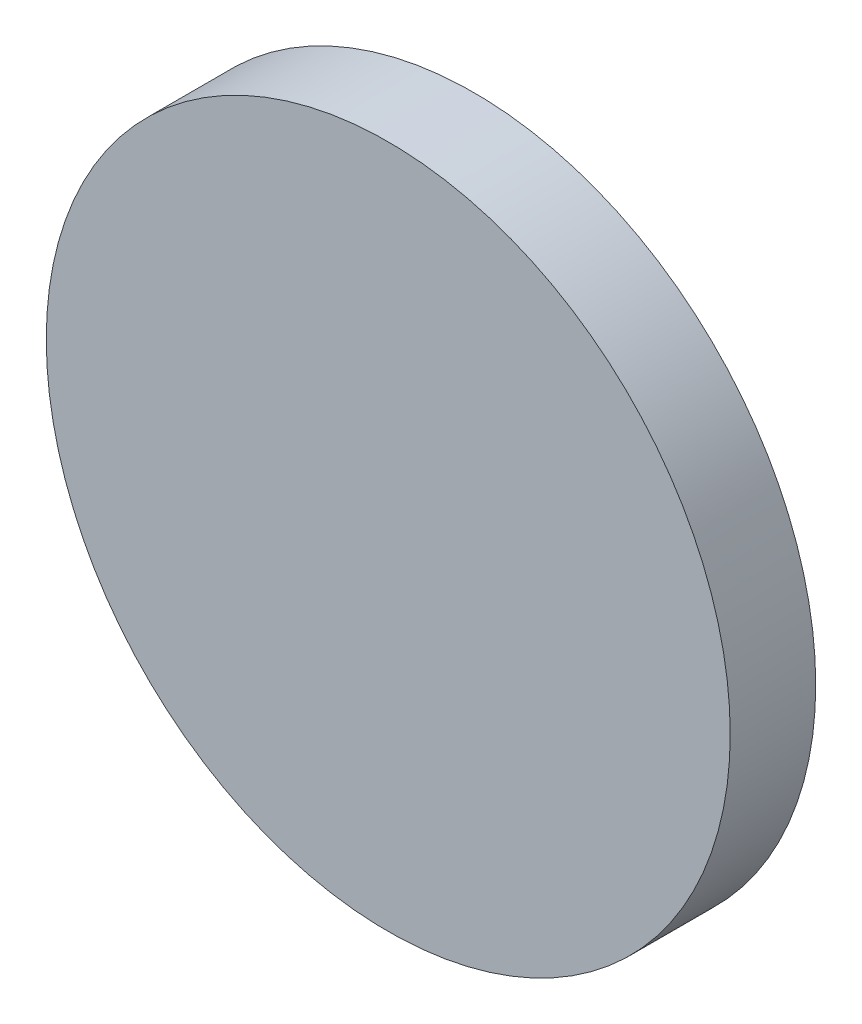
ISO-10303-21;
HEADER;
FILE_DESCRIPTION(('STEP AP214'),'2;1');
FILE_NAME('part.step','',(''),(''),'','','');
FILE_SCHEMA(('AUTOMOTIVE_DESIGN { 1 0 10303 214 1 1 1 1 }'));
ENDSEC;
DATA;
#1=APPLICATION_CONTEXT('core data for automotive mechanical design processes');
#2=APPLICATION_PROTOCOL_DEFINITION('international standard','automotive_design',2000,#1);
#3=PRODUCT_CONTEXT('',#1,'mechanical');
#4=PRODUCT('Part','Part','',(#3));
#5=PRODUCT_RELATED_PRODUCT_CATEGORY('part','',(#4));
#6=PRODUCT_DEFINITION_FORMATION('','',#4);
#7=PRODUCT_DEFINITION_CONTEXT('part definition',#1,'design');
#8=PRODUCT_DEFINITION('design','',#6,#7);
#9=PRODUCT_DEFINITION_SHAPE('','',#8);
#10=(LENGTH_UNIT() NAMED_UNIT(*) SI_UNIT(.MILLI.,.METRE.));
#11=(NAMED_UNIT(*) PLANE_ANGLE_UNIT() SI_UNIT($,.RADIAN.));
#12=(NAMED_UNIT(*) SI_UNIT($,.STERADIAN.) SOLID_ANGLE_UNIT());
#13=UNCERTAINTY_MEASURE_WITH_UNIT(LENGTH_MEASURE(1.E-05),#10,'distance_accuracy_value','');
#14=(GEOMETRIC_REPRESENTATION_CONTEXT(3) GLOBAL_UNCERTAINTY_ASSIGNED_CONTEXT((#13)) GLOBAL_UNIT_ASSIGNED_CONTEXT((#10,
#11,#12)) REPRESENTATION_CONTEXT('',''));
#15=CARTESIAN_POINT('',(0.,0.,0.));
#16=DIRECTION('',(0.,0.,1.));
#17=DIRECTION('',(1.,0.,0.));
#18=AXIS2_PLACEMENT_3D('',#15,#16,#17);
#19=CARTESIAN_POINT('',(0.,0.,5.));
#20=DIRECTION('',(0.,0.,-1.));
#21=DIRECTION('',(-1.,0.,0.));
#22=AXIS2_PLACEMENT_3D('',#19,#20,#21);
#23=CYLINDRICAL_SURFACE('',#22,20.);
#24=CARTESIAN_POINT('',(0.,0.,5.));
#25=DIRECTION('',(0.,0.,1.));
#26=DIRECTION('',(1.,0.,0.));
#27=AXIS2_PLACEMENT_3D('',#24,#25,#26);
#28=CIRCLE('',#27,20.);
#29=CARTESIAN_POINT('',(20.,0.,5.));
#30=VERTEX_POINT('',#29);
#31=EDGE_CURVE('E10',#30,#30,#28,.T.);
#32=ORIENTED_EDGE('',*,*,#31,.F.);
#33=EDGE_LOOP('',(#32));
#34=FACE_BOUND('',#33,.T.);
#35=CARTESIAN_POINT('',(0.,0.,0.));
#36=DIRECTION('',(0.,0.,1.));
#37=DIRECTION('',(1.,0.,0.));
#38=AXIS2_PLACEMENT_3D('',#35,#36,#37);
#39=CIRCLE('',#38,20.);
#40=CARTESIAN_POINT('',(20.,0.,0.));
#41=VERTEX_POINT('',#40);
#42=EDGE_CURVE('E34',#41,#41,#39,.T.);
#43=ORIENTED_EDGE('',*,*,#42,.T.);
#44=EDGE_LOOP('',(#43));
#45=FACE_BOUND('',#44,.T.);
#46=ADVANCED_FACE('F31',(#34,#45),#23,.T.);
#47=CARTESIAN_POINT('',(0.,0.,5.));
#48=DIRECTION('',(0.,0.,1.));
#49=DIRECTION('',(1.,0.,0.));
#50=AXIS2_PLACEMENT_3D('',#47,#48,#49);
#51=PLANE('',#50);
#52=ORIENTED_EDGE('',*,*,#31,.T.);
#53=EDGE_LOOP('',(#52));
#54=FACE_BOUND('',#53,.T.);
#55=ADVANCED_FACE('F46',(#54),#51,.T.);
#56=CARTESIAN_POINT('',(0.,0.,0.));
#57=DIRECTION('',(0.,0.,1.));
#58=DIRECTION('',(1.,0.,0.));
#59=AXIS2_PLACEMENT_3D('',#56,#57,#58);
#60=PLANE('',#59);
#61=ORIENTED_EDGE('',*,*,#42,.F.);
#62=EDGE_LOOP('',(#61));
#63=FACE_BOUND('',#62,.T.);
#64=ADVANCED_FACE('F44',(#63),#60,.F.);
#65=CLOSED_SHELL('',(#46,#55,#64));
#66=MANIFOLD_SOLID_BREP('B2',#65);
#67=ADVANCED_BREP_SHAPE_REPRESENTATION('',(#18,#66),#14);
#68=SHAPE_DEFINITION_REPRESENTATION(#9,#67);
ENDSEC;
END-ISO-10303-21;
